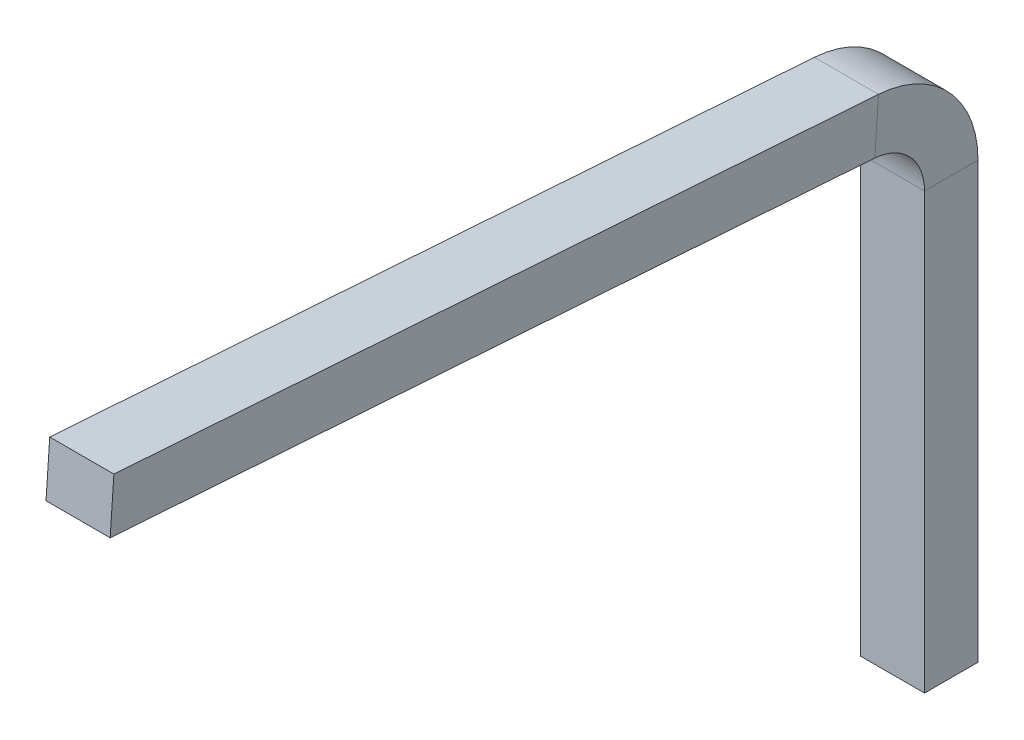
ISO-10303-21;
HEADER;
FILE_DESCRIPTION(('STEP AP214'),'2;1');
FILE_NAME('part.step','',(''),(''),'','','');
FILE_SCHEMA(('AUTOMOTIVE_DESIGN { 1 0 10303 214 1 1 1 1 }'));
ENDSEC;
DATA;
#1=APPLICATION_CONTEXT('core data for automotive mechanical design processes');
#2=APPLICATION_PROTOCOL_DEFINITION('international standard','automotive_design',2000,#1);
#3=PRODUCT_CONTEXT('',#1,'mechanical');
#4=PRODUCT('Part','Part','',(#3));
#5=PRODUCT_RELATED_PRODUCT_CATEGORY('part','',(#4));
#6=PRODUCT_DEFINITION_FORMATION('','',#4);
#7=PRODUCT_DEFINITION_CONTEXT('part definition',#1,'design');
#8=PRODUCT_DEFINITION('design','',#6,#7);
#9=PRODUCT_DEFINITION_SHAPE('','',#8);
#10=(LENGTH_UNIT() NAMED_UNIT(*) SI_UNIT(.MILLI.,.METRE.));
#11=(NAMED_UNIT(*) PLANE_ANGLE_UNIT() SI_UNIT($,.RADIAN.));
#12=(NAMED_UNIT(*) SI_UNIT($,.STERADIAN.) SOLID_ANGLE_UNIT());
#13=UNCERTAINTY_MEASURE_WITH_UNIT(LENGTH_MEASURE(1.E-05),#10,'distance_accuracy_value','');
#14=(GEOMETRIC_REPRESENTATION_CONTEXT(3) GLOBAL_UNCERTAINTY_ASSIGNED_CONTEXT((#13)) GLOBAL_UNIT_ASSIGNED_CONTEXT((#10,
#11,#12)) REPRESENTATION_CONTEXT('',''));
#15=CARTESIAN_POINT('',(0.,0.,0.));
#16=DIRECTION('',(0.,0.,1.));
#17=DIRECTION('',(1.,0.,0.));
#18=AXIS2_PLACEMENT_3D('',#15,#16,#17);
#19=CARTESIAN_POINT('',(0.,25.524052551824,8.1153243301732));
#20=DIRECTION('',(0.,0.0697564737441219,0.997564050259825));
#21=DIRECTION('',(0.,-0.997564050259825,0.0697564737441219));
#22=AXIS2_PLACEMENT_3D('',#19,#20,#21);
#23=PLANE('',#22);
#24=DIRECTION('',(1.,0.,0.));
#25=VECTOR('',#24,1.);
#26=CARTESIAN_POINT('',(0.,26.0228345769539,8.0804460933012));
#27=LINE('',#26,#25);
#28=CARTESIAN_POINT('',(32.0102996083547,26.0228345769539,8.0804460933012));
#29=VERTEX_POINT('',#28);
#30=CARTESIAN_POINT('',(32.6102996083546,26.0228345769539,8.0804460933012));
#31=VERTEX_POINT('',#30);
#32=EDGE_CURVE('E11',#29,#31,#27,.T.);
#33=ORIENTED_EDGE('',*,*,#32,.F.);
#34=DIRECTION('',(0.,0.997564050259824,-0.0697564737441219));
#35=VECTOR('',#34,1.);
#36=CARTESIAN_POINT('',(32.0102996083547,25.524052551824,8.1153243301732));
#37=LINE('',#36,#35);
#38=CARTESIAN_POINT('',(32.0102996083547,25.524052551824,8.1153243301732));
#39=VERTEX_POINT('',#38);
#40=EDGE_CURVE('E24',#39,#29,#37,.T.);
#41=ORIENTED_EDGE('',*,*,#40,.F.);
#42=DIRECTION('',(1.,0.,0.));
#43=VECTOR('',#42,1.);
#44=CARTESIAN_POINT('',(0.,25.524052551824,8.1153243301732));
#45=LINE('',#44,#43);
#46=CARTESIAN_POINT('',(32.6102996083546,25.524052551824,8.1153243301732));
#47=VERTEX_POINT('',#46);
#48=EDGE_CURVE('E154',#39,#47,#45,.T.);
#49=ORIENTED_EDGE('',*,*,#48,.T.);
#50=DIRECTION('',(0.,0.997564050259824,-0.0697564737441219));
#51=VECTOR('',#50,1.);
#52=CARTESIAN_POINT('',(32.6102996083546,25.524052551824,8.1153243301732));
#53=LINE('',#52,#51);
#54=EDGE_CURVE('E152',#47,#31,#53,.T.);
#55=ORIENTED_EDGE('',*,*,#54,.T.);
#56=EDGE_LOOP('',(#33,#41,#49,#55));
#57=FACE_BOUND('',#56,.T.);
#58=ADVANCED_FACE('F17',(#57),#23,.T.);
#59=CARTESIAN_POINT('',(0.,23.2347371860179,-24.623410672584));
#60=DIRECTION('',(0.,-0.997564050259825,0.0697564737441219));
#61=DIRECTION('',(1.,0.,0.));
#62=AXIS2_PLACEMENT_3D('',#59,#60,#61);
#63=PLANE('',#62);
#64=DIRECTION('',(-1.,0.,0.));
#65=VECTOR('',#64,1.);
#66=CARTESIAN_POINT('',(0.,25.0240616815602,0.965121763127939));
#67=LINE('',#66,#65);
#68=CARTESIAN_POINT('',(32.6102996083546,25.0240616815602,0.965121763127939));
#69=VERTEX_POINT('',#68);
#70=CARTESIAN_POINT('',(32.0102996083547,25.0240616815602,0.96512176312794));
#71=VERTEX_POINT('',#70);
#72=EDGE_CURVE('E150',#69,#71,#67,.T.);
#73=ORIENTED_EDGE('',*,*,#72,.F.);
#74=DIRECTION('',(0.,-0.0697564737441219,-0.997564050259824));
#75=VECTOR('',#74,1.);
#76=CARTESIAN_POINT('',(32.6102996083546,23.2347371860179,-24.623410672584));
#77=LINE('',#76,#75);
#78=EDGE_CURVE('E147',#47,#69,#77,.T.);
#79=ORIENTED_EDGE('',*,*,#78,.F.);
#80=ORIENTED_EDGE('',*,*,#48,.F.);
#81=DIRECTION('',(0.,0.0697564737441219,0.997564050259824));
#82=VECTOR('',#81,1.);
#83=CARTESIAN_POINT('',(32.0102996083547,23.2347371860179,-24.623410672584));
#84=LINE('',#83,#82);
#85=EDGE_CURVE('E144',#71,#39,#84,.T.);
#86=ORIENTED_EDGE('',*,*,#85,.F.);
#87=EDGE_LOOP('',(#73,#79,#80,#86));
#88=FACE_BOUND('',#87,.T.);
#89=ADVANCED_FACE('F184',(#88),#63,.T.);
#90=CARTESIAN_POINT('',(32.0102996083547,23.2347371860179,-24.623410672584));
#91=DIRECTION('',(-1.,0.,0.));
#92=DIRECTION('',(0.,-0.997564050259825,0.0697564737441219));
#93=AXIS2_PLACEMENT_3D('',#90,#91,#92);
#94=PLANE('',#93);
#95=DIRECTION('',(0.,0.997564050259825,-0.069756473744115));
#96=VECTOR('',#95,1.);
#97=CARTESIAN_POINT('',(32.0102996083547,25.0240616815601,0.965121763127949));
#98=LINE('',#97,#96);
#99=CARTESIAN_POINT('',(32.0102996083547,25.5228437066902,0.930243526255876));
#100=VERTEX_POINT('',#99);
#101=EDGE_CURVE('E142',#71,#100,#98,.T.);
#102=ORIENTED_EDGE('',*,*,#101,.F.);
#103=ORIENTED_EDGE('',*,*,#85,.T.);
#104=ORIENTED_EDGE('',*,*,#40,.T.);
#105=DIRECTION('',(0.,0.0697564737441219,0.997564050259824));
#106=VECTOR('',#105,1.);
#107=CARTESIAN_POINT('',(32.0102996083547,23.7335192111478,-24.658288909456));
#108=LINE('',#107,#106);
#109=EDGE_CURVE('E140',#100,#29,#108,.T.);
#110=ORIENTED_EDGE('',*,*,#109,.F.);
#111=EDGE_LOOP('',(#102,#103,#104,#110));
#112=FACE_BOUND('',#111,.T.);
#113=ADVANCED_FACE('F158',(#112),#94,.T.);
#114=CARTESIAN_POINT('',(0.,23.7335192111478,-24.658288909456));
#115=DIRECTION('',(0.,-0.997564050259825,0.0697564737441219));
#116=DIRECTION('',(1.,0.,0.));
#117=AXIS2_PLACEMENT_3D('',#114,#115,#116);
#118=PLANE('',#117);
#119=DIRECTION('',(0.,-0.0697564737441219,-0.997564050259824));
#120=VECTOR('',#119,1.);
#121=CARTESIAN_POINT('',(32.6102996083546,23.7335192111478,-24.658288909456));
#122=LINE('',#121,#120);
#123=CARTESIAN_POINT('',(32.6102996083546,25.5228437066902,0.930243526255876));
#124=VERTEX_POINT('',#123);
#125=EDGE_CURVE('E138',#31,#124,#122,.T.);
#126=ORIENTED_EDGE('',*,*,#125,.T.);
#127=DIRECTION('',(-1.,0.,0.));
#128=VECTOR('',#127,1.);
#129=CARTESIAN_POINT('',(0.,25.5228437066902,0.93024352625588));
#130=LINE('',#129,#128);
#131=EDGE_CURVE('E135',#124,#100,#130,.T.);
#132=ORIENTED_EDGE('',*,*,#131,.T.);
#133=ORIENTED_EDGE('',*,*,#109,.T.);
#134=ORIENTED_EDGE('',*,*,#32,.T.);
#135=EDGE_LOOP('',(#126,#132,#133,#134));
#136=FACE_BOUND('',#135,.T.);
#137=ADVANCED_FACE('F161',(#136),#118,.F.);
#138=CARTESIAN_POINT('',(32.6102996083546,23.2347371860179,-24.623410672584));
#139=DIRECTION('',(1.,0.,0.));
#140=DIRECTION('',(0.,0.997564050259825,-0.0697564737441219));
#141=AXIS2_PLACEMENT_3D('',#138,#139,#140);
#142=PLANE('',#141);
#143=DIRECTION('',(0.,-0.997564050259825,0.069756473744115));
#144=VECTOR('',#143,1.);
#145=CARTESIAN_POINT('',(32.6102996083546,25.0240616815601,0.965121763127949));
#146=LINE('',#145,#144);
#147=EDGE_CURVE('E132',#124,#69,#146,.T.);
#148=ORIENTED_EDGE('',*,*,#147,.F.);
#149=ORIENTED_EDGE('',*,*,#125,.F.);
#150=ORIENTED_EDGE('',*,*,#54,.F.);
#151=ORIENTED_EDGE('',*,*,#78,.T.);
#152=EDGE_LOOP('',(#148,#149,#150,#151));
#153=FACE_BOUND('',#152,.T.);
#154=ADVANCED_FACE('F187',(#153),#142,.T.);
#155=CARTESIAN_POINT('',(33.6804399736704,24.5252796564303,1.));
#156=DIRECTION('',(-1.,0.,0.));
#157=DIRECTION('',(0.,0.,1.));
#158=AXIS2_PLACEMENT_3D('',#155,#156,#157);
#159=CYLINDRICAL_SURFACE('',#158,0.5);
#160=CARTESIAN_POINT('',(32.0102996083547,24.5252796564303,1.));
#161=DIRECTION('',(-1.,0.,0.));
#162=DIRECTION('',(0.,0.,-1.));
#163=AXIS2_PLACEMENT_3D('',#160,#161,#162);
#164=CIRCLE('',#163,0.5);
#165=CARTESIAN_POINT('',(32.0102996083547,24.5252796564303,0.5));
#166=VERTEX_POINT('',#165);
#167=EDGE_CURVE('E129',#71,#166,#164,.T.);
#168=ORIENTED_EDGE('',*,*,#167,.T.);
#169=DIRECTION('',(-1.,0.,0.));
#170=VECTOR('',#169,1.);
#171=CARTESIAN_POINT('',(0.,24.5252796564303,0.5));
#172=LINE('',#171,#170);
#173=CARTESIAN_POINT('',(32.6102996083546,24.5252796564303,0.5));
#174=VERTEX_POINT('',#173);
#175=EDGE_CURVE('E127',#174,#166,#172,.T.);
#176=ORIENTED_EDGE('',*,*,#175,.F.);
#177=CARTESIAN_POINT('',(32.6102996083546,24.5252796564303,1.));
#178=DIRECTION('',(1.,0.,0.));
#179=DIRECTION('',(0.,0.,1.));
#180=AXIS2_PLACEMENT_3D('',#177,#178,#179);
#181=CIRCLE('',#180,0.5);
#182=EDGE_CURVE('E124',#174,#69,#181,.T.);
#183=ORIENTED_EDGE('',*,*,#182,.T.);
#184=ORIENTED_EDGE('',*,*,#72,.T.);
#185=EDGE_LOOP('',(#168,#176,#183,#184));
#186=FACE_BOUND('',#185,.T.);
#187=ADVANCED_FACE('F181',(#186),#159,.F.);
#188=CARTESIAN_POINT('',(32.0102996083547,24.5252796564303,1.));
#189=DIRECTION('',(1.,0.,0.));
#190=DIRECTION('',(0.,0.,-1.));
#191=AXIS2_PLACEMENT_3D('',#188,#189,#190);
#192=PLANE('',#191);
#193=ORIENTED_EDGE('',*,*,#101,.T.);
#194=CARTESIAN_POINT('',(32.0102996083547,24.5252796564303,1.));
#195=DIRECTION('',(-1.,0.,0.));
#196=DIRECTION('',(0.,0.,1.));
#197=AXIS2_PLACEMENT_3D('',#194,#195,#196);
#198=CIRCLE('',#197,1.);
#199=CARTESIAN_POINT('',(32.0102996083547,24.5252796564303,0.));
#200=VERTEX_POINT('',#199);
#201=EDGE_CURVE('E122',#100,#200,#198,.T.);
#202=ORIENTED_EDGE('',*,*,#201,.T.);
#203=DIRECTION('',(0.,0.,-1.));
#204=VECTOR('',#203,1.);
#205=CARTESIAN_POINT('',(32.0102996083547,24.5252796564303,0.500000000000171));
#206=LINE('',#205,#204);
#207=EDGE_CURVE('E119',#166,#200,#206,.T.);
#208=ORIENTED_EDGE('',*,*,#207,.F.);
#209=ORIENTED_EDGE('',*,*,#167,.F.);
#210=EDGE_LOOP('',(#193,#202,#208,#209));
#211=FACE_BOUND('',#210,.T.);
#212=ADVANCED_FACE('F171',(#211),#192,.F.);
#213=CARTESIAN_POINT('',(33.6804399736704,24.5252796564303,1.));
#214=DIRECTION('',(-1.,0.,0.));
#215=DIRECTION('',(0.,0.,1.));
#216=AXIS2_PLACEMENT_3D('',#213,#214,#215);
#217=CYLINDRICAL_SURFACE('',#216,1.);
#218=ORIENTED_EDGE('',*,*,#201,.F.);
#219=ORIENTED_EDGE('',*,*,#131,.F.);
#220=CARTESIAN_POINT('',(32.6102996083546,24.5252796564303,1.));
#221=DIRECTION('',(1.,0.,0.));
#222=DIRECTION('',(0.,0.,1.));
#223=AXIS2_PLACEMENT_3D('',#220,#221,#222);
#224=CIRCLE('',#223,1.);
#225=CARTESIAN_POINT('',(32.6102996083546,24.5252796564303,0.));
#226=VERTEX_POINT('',#225);
#227=EDGE_CURVE('E116',#226,#124,#224,.T.);
#228=ORIENTED_EDGE('',*,*,#227,.F.);
#229=DIRECTION('',(-1.,0.,0.));
#230=VECTOR('',#229,1.);
#231=CARTESIAN_POINT('',(0.,24.5252796564303,0.));
#232=LINE('',#231,#230);
#233=EDGE_CURVE('E113',#226,#200,#232,.T.);
#234=ORIENTED_EDGE('',*,*,#233,.T.);
#235=EDGE_LOOP('',(#218,#219,#228,#234));
#236=FACE_BOUND('',#235,.T.);
#237=ADVANCED_FACE('F167',(#236),#217,.T.);
#238=CARTESIAN_POINT('',(32.0102996083547,0.,0.5));
#239=DIRECTION('',(-1.,0.,0.));
#240=DIRECTION('',(0.,0.,1.));
#241=AXIS2_PLACEMENT_3D('',#238,#239,#240);
#242=PLANE('',#241);
#243=DIRECTION('',(0.,1.,0.));
#244=VECTOR('',#243,1.);
#245=CARTESIAN_POINT('',(32.0102996083547,0.,0.));
#246=LINE('',#245,#244);
#247=CARTESIAN_POINT('',(32.0102996083547,20.4586796564352,0.));
#248=VERTEX_POINT('',#247);
#249=EDGE_CURVE('E110',#248,#200,#246,.T.);
#250=ORIENTED_EDGE('',*,*,#249,.F.);
#251=DIRECTION('',(0.,0.,1.));
#252=VECTOR('',#251,1.);
#253=CARTESIAN_POINT('',(32.0102996083547,20.4586796564352,0.5));
#254=LINE('',#253,#252);
#255=CARTESIAN_POINT('',(32.0102996083547,20.4586796564352,0.5));
#256=VERTEX_POINT('',#255);
#257=EDGE_CURVE('E108',#248,#256,#254,.T.);
#258=ORIENTED_EDGE('',*,*,#257,.T.);
#259=DIRECTION('',(0.,1.,0.));
#260=VECTOR('',#259,1.);
#261=CARTESIAN_POINT('',(32.0102996083547,0.,0.5));
#262=LINE('',#261,#260);
#263=EDGE_CURVE('E83',#256,#166,#262,.T.);
#264=ORIENTED_EDGE('',*,*,#263,.T.);
#265=ORIENTED_EDGE('',*,*,#207,.T.);
#266=EDGE_LOOP('',(#250,#258,#264,#265));
#267=FACE_BOUND('',#266,.T.);
#268=ADVANCED_FACE('F174',(#267),#242,.T.);
#269=CARTESIAN_POINT('',(32.6102996083546,24.5252796564303,1.));
#270=DIRECTION('',(-1.,0.,0.));
#271=DIRECTION('',(0.,0.,1.));
#272=AXIS2_PLACEMENT_3D('',#269,#270,#271);
#273=PLANE('',#272);
#274=DIRECTION('',(0.,0.,1.));
#275=VECTOR('',#274,1.);
#276=CARTESIAN_POINT('',(32.6102996083546,24.5252796564303,0.500000000000171));
#277=LINE('',#276,#275);
#278=EDGE_CURVE('E96',#226,#174,#277,.T.);
#279=ORIENTED_EDGE('',*,*,#278,.F.);
#280=ORIENTED_EDGE('',*,*,#227,.T.);
#281=ORIENTED_EDGE('',*,*,#147,.T.);
#282=ORIENTED_EDGE('',*,*,#182,.F.);
#283=EDGE_LOOP('',(#279,#280,#281,#282));
#284=FACE_BOUND('',#283,.T.);
#285=ADVANCED_FACE('F178',(#284),#273,.F.);
#286=CARTESIAN_POINT('',(0.,0.,0.));
#287=DIRECTION('',(0.,0.,1.));
#288=DIRECTION('',(1.,0.,0.));
#289=AXIS2_PLACEMENT_3D('',#286,#287,#288);
#290=PLANE('',#289);
#291=DIRECTION('',(1.,0.,0.));
#292=VECTOR('',#291,1.);
#293=CARTESIAN_POINT('',(0.,20.4586796564352,0.));
#294=LINE('',#293,#292);
#295=CARTESIAN_POINT('',(32.6102996083546,20.4586796564352,0.));
#296=VERTEX_POINT('',#295);
#297=EDGE_CURVE('E100',#248,#296,#294,.T.);
#298=ORIENTED_EDGE('',*,*,#297,.F.);
#299=ORIENTED_EDGE('',*,*,#249,.T.);
#300=ORIENTED_EDGE('',*,*,#233,.F.);
#301=DIRECTION('',(0.,-1.,0.));
#302=VECTOR('',#301,1.);
#303=CARTESIAN_POINT('',(32.6102996083546,0.,0.));
#304=LINE('',#303,#302);
#305=EDGE_CURVE('E87',#226,#296,#304,.T.);
#306=ORIENTED_EDGE('',*,*,#305,.T.);
#307=EDGE_LOOP('',(#298,#299,#300,#306));
#308=FACE_BOUND('',#307,.T.);
#309=ADVANCED_FACE('F176',(#308),#290,.F.);
#310=CARTESIAN_POINT('',(0.,0.,0.5));
#311=DIRECTION('',(0.,0.,1.));
#312=DIRECTION('',(1.,0.,0.));
#313=AXIS2_PLACEMENT_3D('',#310,#311,#312);
#314=PLANE('',#313);
#315=ORIENTED_EDGE('',*,*,#263,.F.);
#316=DIRECTION('',(1.,0.,0.));
#317=VECTOR('',#316,1.);
#318=CARTESIAN_POINT('',(0.,20.4586796564352,0.5));
#319=LINE('',#318,#317);
#320=CARTESIAN_POINT('',(32.6102996083546,20.4586796564352,0.5));
#321=VERTEX_POINT('',#320);
#322=EDGE_CURVE('E78',#256,#321,#319,.T.);
#323=ORIENTED_EDGE('',*,*,#322,.T.);
#324=DIRECTION('',(0.,-1.,0.));
#325=VECTOR('',#324,1.);
#326=CARTESIAN_POINT('',(32.6102996083546,0.,0.5));
#327=LINE('',#326,#325);
#328=EDGE_CURVE('E81',#174,#321,#327,.T.);
#329=ORIENTED_EDGE('',*,*,#328,.F.);
#330=ORIENTED_EDGE('',*,*,#175,.T.);
#331=EDGE_LOOP('',(#315,#323,#329,#330));
#332=FACE_BOUND('',#331,.T.);
#333=ADVANCED_FACE('F80',(#332),#314,.T.);
#334=CARTESIAN_POINT('',(32.6102996083546,0.,0.5));
#335=DIRECTION('',(1.,0.,0.));
#336=DIRECTION('',(0.,0.,-1.));
#337=AXIS2_PLACEMENT_3D('',#334,#335,#336);
#338=PLANE('',#337);
#339=ORIENTED_EDGE('',*,*,#328,.T.);
#340=DIRECTION('',(0.,0.,-1.));
#341=VECTOR('',#340,1.);
#342=CARTESIAN_POINT('',(32.6102996083546,20.4586796564352,0.5));
#343=LINE('',#342,#341);
#344=EDGE_CURVE('E94',#321,#296,#343,.T.);
#345=ORIENTED_EDGE('',*,*,#344,.T.);
#346=ORIENTED_EDGE('',*,*,#305,.F.);
#347=ORIENTED_EDGE('',*,*,#278,.T.);
#348=EDGE_LOOP('',(#339,#345,#346,#347));
#349=FACE_BOUND('',#348,.T.);
#350=ADVANCED_FACE('F92',(#349),#338,.T.);
#351=CARTESIAN_POINT('',(-0.00029960835417188,20.4586796564352,-0.01));
#352=DIRECTION('',(0.,-1.,0.));
#353=DIRECTION('',(0.,0.,-1.));
#354=AXIS2_PLACEMENT_3D('',#351,#352,#353);
#355=PLANE('',#354);
#356=ORIENTED_EDGE('',*,*,#322,.F.);
#357=ORIENTED_EDGE('',*,*,#257,.F.);
#358=ORIENTED_EDGE('',*,*,#297,.T.);
#359=ORIENTED_EDGE('',*,*,#344,.F.);
#360=EDGE_LOOP('',(#356,#357,#358,#359));
#361=FACE_BOUND('',#360,.T.);
#362=ADVANCED_FACE('F98',(#361),#355,.T.);
#363=CLOSED_SHELL('',(#58,#89,#113,#137,#154,#187,#212,#237,#268,#285,#309,#333,#350,#362));
#364=MANIFOLD_SOLID_BREP('B1',#363);
#365=ADVANCED_BREP_SHAPE_REPRESENTATION('',(#18,#364),#14);
#366=SHAPE_DEFINITION_REPRESENTATION(#9,#365);
ENDSEC;
END-ISO-10303-21;
